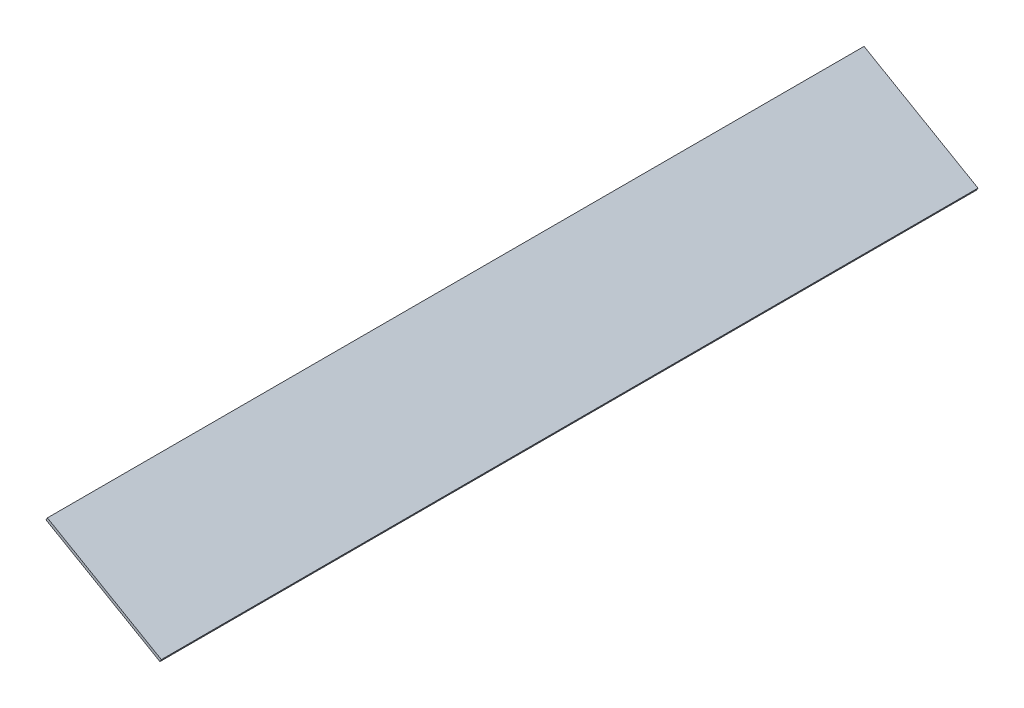
ISO-10303-21;
HEADER;
FILE_DESCRIPTION(('STEP AP214'),'2;1');
FILE_NAME('part.step','',(''),(''),'','','');
FILE_SCHEMA(('AUTOMOTIVE_DESIGN { 1 0 10303 214 1 1 1 1 }'));
ENDSEC;
DATA;
#1=APPLICATION_CONTEXT('core data for automotive mechanical design processes');
#2=APPLICATION_PROTOCOL_DEFINITION('international standard','automotive_design',2000,#1);
#3=PRODUCT_CONTEXT('',#1,'mechanical');
#4=PRODUCT('Part','Part','',(#3));
#5=PRODUCT_RELATED_PRODUCT_CATEGORY('part','',(#4));
#6=PRODUCT_DEFINITION_FORMATION('','',#4);
#7=PRODUCT_DEFINITION_CONTEXT('part definition',#1,'design');
#8=PRODUCT_DEFINITION('design','',#6,#7);
#9=PRODUCT_DEFINITION_SHAPE('','',#8);
#10=(LENGTH_UNIT() NAMED_UNIT(*) SI_UNIT(.MILLI.,.METRE.));
#11=(NAMED_UNIT(*) PLANE_ANGLE_UNIT() SI_UNIT($,.RADIAN.));
#12=(NAMED_UNIT(*) SI_UNIT($,.STERADIAN.) SOLID_ANGLE_UNIT());
#13=UNCERTAINTY_MEASURE_WITH_UNIT(LENGTH_MEASURE(1.E-05),#10,'distance_accuracy_value','');
#14=(GEOMETRIC_REPRESENTATION_CONTEXT(3) GLOBAL_UNCERTAINTY_ASSIGNED_CONTEXT((#13)) GLOBAL_UNIT_ASSIGNED_CONTEXT((#10,
#11,#12)) REPRESENTATION_CONTEXT('',''));
#15=CARTESIAN_POINT('',(0.,0.,0.));
#16=DIRECTION('',(0.,0.,1.));
#17=DIRECTION('',(1.,0.,0.));
#18=AXIS2_PLACEMENT_3D('',#15,#16,#17);
#19=CARTESIAN_POINT('',(130.757862485606,226.479261313927,914.4));
#20=DIRECTION('',(0.500000000000017,0.866025403784429,0.));
#21=DIRECTION('',(-0.866025403784429,0.500000000000017,0.));
#22=AXIS2_PLACEMENT_3D('',#19,#20,#21);
#23=PLANE('',#22);
#24=DIRECTION('',(-0.86602540378461,0.499999999999703,0.));
#25=VECTOR('',#24,1.);
#26=CARTESIAN_POINT('',(258.340724971561,152.819261314676,1828.8));
#27=LINE('',#26,#25);
#28=CARTESIAN_POINT('',(258.340724971414,152.819261314519,1828.8));
#29=VERTEX_POINT('',#28);
#30=CARTESIAN_POINT('',(3.17500000018662,300.139261314312,1828.8));
#31=VERTEX_POINT('',#30);
#32=EDGE_CURVE('E60',#29,#31,#27,.T.);
#33=ORIENTED_EDGE('',*,*,#32,.F.);
#34=DIRECTION('',(0.,0.,1.));
#35=VECTOR('',#34,1.);
#36=CARTESIAN_POINT('',(258.340724971484,152.819261314737,1808.3229528099));
#37=LINE('',#36,#35);
#38=CARTESIAN_POINT('',(258.340724971289,152.819261314389,0.));
#39=VERTEX_POINT('',#38);
#40=EDGE_CURVE('E19',#29,#39,#37,.F.);
#41=ORIENTED_EDGE('',*,*,#40,.T.);
#42=DIRECTION('',(-0.866025403784403,0.500000000000062,0.));
#43=VECTOR('',#42,1.);
#44=CARTESIAN_POINT('',(258.34072497106,152.819261314155,0.));
#45=LINE('',#44,#43);
#46=CARTESIAN_POINT('',(3.17500000011222,300.139261314188,1.11022302462516E-13));
#47=VERTEX_POINT('',#46);
#48=EDGE_CURVE('E58',#39,#47,#45,.T.);
#49=ORIENTED_EDGE('',*,*,#48,.T.);
#50=DIRECTION('',(0.,0.,1.));
#51=VECTOR('',#50,1.);
#52=CARTESIAN_POINT('',(3.17500000033299,300.139261314676,1808.3229528099));
#53=LINE('',#52,#51);
#54=EDGE_CURVE('E52',#31,#47,#53,.F.);
#55=ORIENTED_EDGE('',*,*,#54,.F.);
#56=EDGE_LOOP('',(#33,#41,#49,#55));
#57=FACE_BOUND('',#56,.T.);
#58=ADVANCED_FACE('F16',(#57),#23,.T.);
#59=CARTESIAN_POINT('',(258.34072497106,152.819261314003,1808.3229528099));
#60=DIRECTION('',(-0.866025403784429,0.500000000000017,0.));
#61=DIRECTION('',(-0.500000000000017,-0.866025403784429,0.));
#62=AXIS2_PLACEMENT_3D('',#59,#60,#61);
#63=PLANE('',#62);
#64=ORIENTED_EDGE('',*,*,#40,.F.);
#65=DIRECTION('',(0.499999999997132,0.866025403786094,0.));
#66=VECTOR('',#65,1.);
#67=CARTESIAN_POINT('',(255.165724971562,147.320000000605,1828.8));
#68=LINE('',#67,#66);
#69=CARTESIAN_POINT('',(255.165724971278,147.320000000231,1828.8));
#70=VERTEX_POINT('',#69);
#71=EDGE_CURVE('E78',#70,#29,#68,.T.);
#72=ORIENTED_EDGE('',*,*,#71,.F.);
#73=DIRECTION('',(0.,0.,1.));
#74=VECTOR('',#73,1.);
#75=CARTESIAN_POINT('',(255.165724971149,147.319999999884,914.4));
#76=LINE('',#75,#74);
#77=CARTESIAN_POINT('',(255.165724971217,147.320000000118,0.));
#78=VERTEX_POINT('',#77);
#79=EDGE_CURVE('E74',#70,#78,#76,.F.);
#80=ORIENTED_EDGE('',*,*,#79,.T.);
#81=DIRECTION('',(0.499999999971925,0.866025403800648,0.));
#82=VECTOR('',#81,1.);
#83=CARTESIAN_POINT('',(255.165724971314,147.320000000152,0.));
#84=LINE('',#83,#82);
#85=EDGE_CURVE('E65',#78,#39,#84,.T.);
#86=ORIENTED_EDGE('',*,*,#85,.T.);
#87=EDGE_LOOP('',(#64,#72,#80,#86));
#88=FACE_BOUND('',#87,.T.);
#89=ADVANCED_FACE('F73',(#88),#63,.F.);
#90=CARTESIAN_POINT('',(112.175957034277,237.207529428315,0.));
#91=DIRECTION('',(0.,0.,1.));
#92=DIRECTION('',(1.,0.,0.));
#93=AXIS2_PLACEMENT_3D('',#90,#91,#92);
#94=PLANE('',#93);
#95=ORIENTED_EDGE('',*,*,#48,.F.);
#96=ORIENTED_EDGE('',*,*,#85,.F.);
#97=DIRECTION('',(-0.866025403784429,0.500000000000017,0.));
#98=VECTOR('',#97,1.);
#99=CARTESIAN_POINT('',(127.582862485606,220.979999999898,0.));
#100=LINE('',#99,#98);
#101=CARTESIAN_POINT('',(7.11233971736192E-11,294.640000000185,1.11022302462516E-13));
#102=VERTEX_POINT('',#101);
#103=EDGE_CURVE('E83',#78,#102,#100,.T.);
#104=ORIENTED_EDGE('',*,*,#103,.T.);
#105=DIRECTION('',(-0.500000000000017,-0.866025403784429,0.));
#106=VECTOR('',#105,1.);
#107=CARTESIAN_POINT('',(3.17500000001778,300.13926131413,4.44089209850063E-13));
#108=LINE('',#107,#106);
#109=EDGE_CURVE('E70',#47,#102,#108,.T.);
#110=ORIENTED_EDGE('',*,*,#109,.F.);
#111=EDGE_LOOP('',(#95,#96,#104,#110));
#112=FACE_BOUND('',#111,.T.);
#113=ADVANCED_FACE('F67',(#112),#94,.F.);
#114=CARTESIAN_POINT('',(3.17500000001778,300.13926131413,1808.3229528099));
#115=DIRECTION('',(-0.866025403784429,0.500000000000017,0.));
#116=DIRECTION('',(-0.500000000000017,-0.866025403784429,0.));
#117=AXIS2_PLACEMENT_3D('',#114,#115,#116);
#118=PLANE('',#117);
#119=ORIENTED_EDGE('',*,*,#109,.T.);
#120=DIRECTION('',(0.,0.,1.));
#121=VECTOR('',#120,1.);
#122=CARTESIAN_POINT('',(-4.78783679369599E-11,294.639999999977,914.4));
#123=LINE('',#122,#121);
#124=CARTESIAN_POINT('',(1.41712488098411E-10,294.640000000311,1828.8));
#125=VERTEX_POINT('',#124);
#126=EDGE_CURVE('E25',#102,#125,#123,.T.);
#127=ORIENTED_EDGE('',*,*,#126,.T.);
#128=DIRECTION('',(-0.500000000010699,-0.866025403778262,0.));
#129=VECTOR('',#128,1.);
#130=CARTESIAN_POINT('',(3.17500000039672,300.139261314627,1828.8));
#131=LINE('',#130,#129);
#132=EDGE_CURVE('E33',#31,#125,#131,.T.);
#133=ORIENTED_EDGE('',*,*,#132,.F.);
#134=ORIENTED_EDGE('',*,*,#54,.T.);
#135=EDGE_LOOP('',(#119,#127,#133,#134));
#136=FACE_BOUND('',#135,.T.);
#137=ADVANCED_FACE('F87',(#136),#118,.T.);
#138=CARTESIAN_POINT('',(433143.459754782,-249773.520738675,1828.8));
#139=DIRECTION('',(0.,0.,1.));
#140=DIRECTION('',(1.,0.,0.));
#141=AXIS2_PLACEMENT_3D('',#138,#139,#140);
#142=PLANE('',#141);
#143=ORIENTED_EDGE('',*,*,#132,.T.);
#144=DIRECTION('',(-0.866025403784429,0.500000000000017,0.));
#145=VECTOR('',#144,1.);
#146=CARTESIAN_POINT('',(127.582862485606,220.979999999898,1828.8));
#147=LINE('',#146,#145);
#148=EDGE_CURVE('E11',#125,#70,#147,.F.);
#149=ORIENTED_EDGE('',*,*,#148,.T.);
#150=ORIENTED_EDGE('',*,*,#71,.T.);
#151=ORIENTED_EDGE('',*,*,#32,.T.);
#152=EDGE_LOOP('',(#143,#149,#150,#151));
#153=FACE_BOUND('',#152,.T.);
#154=ADVANCED_FACE('F90',(#153),#142,.T.);
#155=CARTESIAN_POINT('',(127.582862485606,220.979999999898,914.4));
#156=DIRECTION('',(0.500000000000017,0.866025403784429,0.));
#157=DIRECTION('',(-0.866025403784429,0.500000000000017,0.));
#158=AXIS2_PLACEMENT_3D('',#155,#156,#157);
#159=PLANE('',#158);
#160=ORIENTED_EDGE('',*,*,#126,.F.);
#161=ORIENTED_EDGE('',*,*,#103,.F.);
#162=ORIENTED_EDGE('',*,*,#79,.F.);
#163=ORIENTED_EDGE('',*,*,#148,.F.);
#164=EDGE_LOOP('',(#160,#161,#162,#163));
#165=FACE_BOUND('',#164,.T.);
#166=ADVANCED_FACE('F89',(#165),#159,.F.);
#167=CLOSED_SHELL('',(#58,#89,#113,#137,#154,#166));
#168=MANIFOLD_SOLID_BREP('B1',#167);
#169=ADVANCED_BREP_SHAPE_REPRESENTATION('',(#18,#168),#14);
#170=SHAPE_DEFINITION_REPRESENTATION(#9,#169);
ENDSEC;
END-ISO-10303-21;
